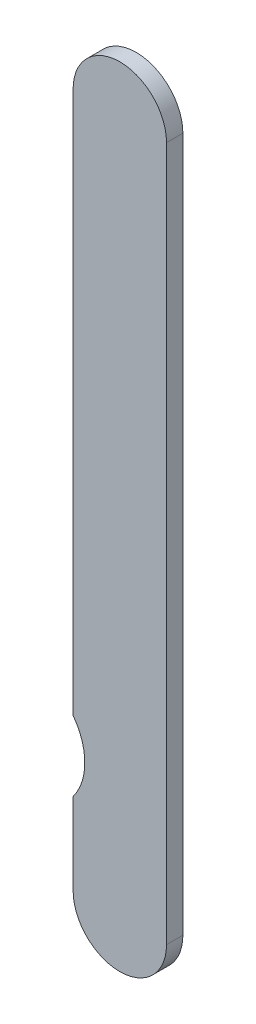
ISO-10303-21;
HEADER;
FILE_DESCRIPTION(('STEP AP214'),'2;1');
FILE_NAME('part.step','',(''),(''),'','','');
FILE_SCHEMA(('AUTOMOTIVE_DESIGN { 1 0 10303 214 1 1 1 1 }'));
ENDSEC;
DATA;
#1=APPLICATION_CONTEXT('core data for automotive mechanical design processes');
#2=APPLICATION_PROTOCOL_DEFINITION('international standard','automotive_design',2000,#1);
#3=PRODUCT_CONTEXT('',#1,'mechanical');
#4=PRODUCT('Part','Part','',(#3));
#5=PRODUCT_RELATED_PRODUCT_CATEGORY('part','',(#4));
#6=PRODUCT_DEFINITION_FORMATION('','',#4);
#7=PRODUCT_DEFINITION_CONTEXT('part definition',#1,'design');
#8=PRODUCT_DEFINITION('design','',#6,#7);
#9=PRODUCT_DEFINITION_SHAPE('','',#8);
#10=(LENGTH_UNIT() NAMED_UNIT(*) SI_UNIT(.MILLI.,.METRE.));
#11=(NAMED_UNIT(*) PLANE_ANGLE_UNIT() SI_UNIT($,.RADIAN.));
#12=(NAMED_UNIT(*) SI_UNIT($,.STERADIAN.) SOLID_ANGLE_UNIT());
#13=UNCERTAINTY_MEASURE_WITH_UNIT(LENGTH_MEASURE(1.E-05),#10,'distance_accuracy_value','');
#14=(GEOMETRIC_REPRESENTATION_CONTEXT(3) GLOBAL_UNCERTAINTY_ASSIGNED_CONTEXT((#13)) GLOBAL_UNIT_ASSIGNED_CONTEXT((#10,
#11,#12)) REPRESENTATION_CONTEXT('',''));
#15=CARTESIAN_POINT('',(0.,0.,0.));
#16=DIRECTION('',(0.,0.,1.));
#17=DIRECTION('',(1.,0.,0.));
#18=AXIS2_PLACEMENT_3D('',#15,#16,#17);
#19=CARTESIAN_POINT('',(82.85,-109.4625,1.6));
#20=DIRECTION('',(1.,0.,0.));
#21=DIRECTION('',(0.,1.,0.));
#22=AXIS2_PLACEMENT_3D('',#19,#20,#21);
#23=PLANE('',#22);
#24=DIRECTION('',(0.,0.,1.));
#25=VECTOR('',#24,1.);
#26=CARTESIAN_POINT('',(82.85,-110.95,1.6));
#27=LINE('',#26,#25);
#28=CARTESIAN_POINT('',(82.85,-110.95,1.6));
#29=VERTEX_POINT('',#28);
#30=CARTESIAN_POINT('',(82.85,-110.95,1.635));
#31=VERTEX_POINT('',#30);
#32=EDGE_CURVE('E11',#29,#31,#27,.T.);
#33=ORIENTED_EDGE('',*,*,#32,.T.);
#34=DIRECTION('',(0.,-1.,0.));
#35=VECTOR('',#34,1.);
#36=CARTESIAN_POINT('',(82.85,-109.4625,1.635));
#37=LINE('',#36,#35);
#38=CARTESIAN_POINT('',(82.85,-110.775,1.635));
#39=VERTEX_POINT('',#38);
#40=EDGE_CURVE('E86',#39,#31,#37,.T.);
#41=ORIENTED_EDGE('',*,*,#40,.F.);
#42=DIRECTION('',(0.,0.,-1.));
#43=VECTOR('',#42,1.);
#44=CARTESIAN_POINT('',(82.85,-110.775,-0.045));
#45=LINE('',#44,#43);
#46=CARTESIAN_POINT('',(82.85,-110.775,1.6));
#47=VERTEX_POINT('',#46);
#48=EDGE_CURVE('E81',#39,#47,#45,.T.);
#49=ORIENTED_EDGE('',*,*,#48,.T.);
#50=DIRECTION('',(0.,-1.,0.));
#51=VECTOR('',#50,1.);
#52=CARTESIAN_POINT('',(82.85,-109.4625,1.6));
#53=LINE('',#52,#51);
#54=EDGE_CURVE('E132',#47,#29,#53,.T.);
#55=ORIENTED_EDGE('',*,*,#54,.T.);
#56=EDGE_LOOP('',(#33,#41,#49,#55));
#57=FACE_BOUND('',#56,.T.);
#58=ADVANCED_FACE('F17',(#57),#23,.F.);
#59=CARTESIAN_POINT('',(82.95,-110.95,1.6));
#60=DIRECTION('',(0.,0.,-1.));
#61=DIRECTION('',(-1.,0.,0.));
#62=AXIS2_PLACEMENT_3D('',#59,#60,#61);
#63=CYLINDRICAL_SURFACE('',#62,0.1);
#64=CARTESIAN_POINT('',(82.95,-110.95,1.6));
#65=DIRECTION('',(0.,0.,1.));
#66=DIRECTION('',(-1.,0.,0.));
#67=AXIS2_PLACEMENT_3D('',#64,#65,#66);
#68=CIRCLE('',#67,0.1);
#69=CARTESIAN_POINT('',(83.05,-110.95,1.6));
#70=VERTEX_POINT('',#69);
#71=EDGE_CURVE('E131',#29,#70,#68,.T.);
#72=ORIENTED_EDGE('',*,*,#71,.T.);
#73=DIRECTION('',(0.,0.,1.));
#74=VECTOR('',#73,1.);
#75=CARTESIAN_POINT('',(83.05,-110.95,1.6));
#76=LINE('',#75,#74);
#77=CARTESIAN_POINT('',(83.05,-110.95,1.635));
#78=VERTEX_POINT('',#77);
#79=EDGE_CURVE('E26',#70,#78,#76,.T.);
#80=ORIENTED_EDGE('',*,*,#79,.T.);
#81=CARTESIAN_POINT('',(82.95,-110.95,1.635));
#82=DIRECTION('',(0.,0.,1.));
#83=DIRECTION('',(-1.,0.,0.));
#84=AXIS2_PLACEMENT_3D('',#81,#82,#83);
#85=CIRCLE('',#84,0.1);
#86=EDGE_CURVE('E91',#31,#78,#85,.T.);
#87=ORIENTED_EDGE('',*,*,#86,.F.);
#88=ORIENTED_EDGE('',*,*,#32,.F.);
#89=EDGE_LOOP('',(#72,#80,#87,#88));
#90=FACE_BOUND('',#89,.T.);
#91=ADVANCED_FACE('F215',(#90),#63,.T.);
#92=CARTESIAN_POINT('',(83.05,-110.95,1.6));
#93=DIRECTION('',(-1.,0.,0.));
#94=DIRECTION('',(0.,0.,1.));
#95=AXIS2_PLACEMENT_3D('',#92,#93,#94);
#96=PLANE('',#95);
#97=DIRECTION('',(0.,1.,0.));
#98=VECTOR('',#97,1.);
#99=CARTESIAN_POINT('',(83.05,-110.95,1.6));
#100=LINE('',#99,#98);
#101=CARTESIAN_POINT('',(83.05,-109.4625,1.6));
#102=VERTEX_POINT('',#101);
#103=EDGE_CURVE('E123',#70,#102,#100,.T.);
#104=ORIENTED_EDGE('',*,*,#103,.T.);
#105=DIRECTION('',(0.,0.,1.));
#106=VECTOR('',#105,1.);
#107=CARTESIAN_POINT('',(83.05,-109.4625,1.6));
#108=LINE('',#107,#106);
#109=CARTESIAN_POINT('',(83.05,-109.4625,1.635));
#110=VERTEX_POINT('',#109);
#111=EDGE_CURVE('E124',#102,#110,#108,.T.);
#112=ORIENTED_EDGE('',*,*,#111,.T.);
#113=DIRECTION('',(0.,1.,0.));
#114=VECTOR('',#113,1.);
#115=CARTESIAN_POINT('',(83.05,-110.95,1.635));
#116=LINE('',#115,#114);
#117=EDGE_CURVE('E127',#78,#110,#116,.T.);
#118=ORIENTED_EDGE('',*,*,#117,.F.);
#119=ORIENTED_EDGE('',*,*,#79,.F.);
#120=EDGE_LOOP('',(#104,#112,#118,#119));
#121=FACE_BOUND('',#120,.T.);
#122=ADVANCED_FACE('F220',(#121),#96,.F.);
#123=CARTESIAN_POINT('',(82.95,-109.4625,1.6));
#124=DIRECTION('',(0.,0.,-1.));
#125=DIRECTION('',(1.,-1.42108547152E-13,0.));
#126=AXIS2_PLACEMENT_3D('',#123,#124,#125);
#127=CYLINDRICAL_SURFACE('',#126,0.1);
#128=CARTESIAN_POINT('',(82.95,-109.4625,1.6));
#129=DIRECTION('',(0.,0.,1.));
#130=DIRECTION('',(1.,-1.42108547152E-13,0.));
#131=AXIS2_PLACEMENT_3D('',#128,#129,#130);
#132=CIRCLE('',#131,0.1);
#133=CARTESIAN_POINT('',(82.85,-109.4625,1.6));
#134=VERTEX_POINT('',#133);
#135=EDGE_CURVE('E108',#102,#134,#132,.T.);
#136=ORIENTED_EDGE('',*,*,#135,.T.);
#137=DIRECTION('',(0.,0.,1.));
#138=VECTOR('',#137,1.);
#139=CARTESIAN_POINT('',(82.85,-109.4625,1.6));
#140=LINE('',#139,#138);
#141=CARTESIAN_POINT('',(82.85,-109.4625,1.635));
#142=VERTEX_POINT('',#141);
#143=EDGE_CURVE('E117',#134,#142,#140,.T.);
#144=ORIENTED_EDGE('',*,*,#143,.T.);
#145=CARTESIAN_POINT('',(82.95,-109.4625,1.635));
#146=DIRECTION('',(0.,0.,1.));
#147=DIRECTION('',(1.,-1.42108547152E-13,0.));
#148=AXIS2_PLACEMENT_3D('',#145,#146,#147);
#149=CIRCLE('',#148,0.1);
#150=EDGE_CURVE('E92',#110,#142,#149,.T.);
#151=ORIENTED_EDGE('',*,*,#150,.F.);
#152=ORIENTED_EDGE('',*,*,#111,.F.);
#153=EDGE_LOOP('',(#136,#144,#151,#152));
#154=FACE_BOUND('',#153,.T.);
#155=ADVANCED_FACE('F219',(#154),#127,.T.);
#156=CARTESIAN_POINT('',(82.85,-109.4625,1.635));
#157=DIRECTION('',(0.,0.,1.));
#158=DIRECTION('',(1.,0.,0.));
#159=AXIS2_PLACEMENT_3D('',#156,#157,#158);
#160=PLANE('',#159);
#161=ORIENTED_EDGE('',*,*,#150,.T.);
#162=DIRECTION('',(0.,-1.,0.));
#163=VECTOR('',#162,1.);
#164=CARTESIAN_POINT('',(82.85,-109.4625,1.635));
#165=LINE('',#164,#163);
#166=CARTESIAN_POINT('',(82.85,-110.6249999999,1.635));
#167=VERTEX_POINT('',#166);
#168=EDGE_CURVE('E105',#142,#167,#165,.T.);
#169=ORIENTED_EDGE('',*,*,#168,.T.);
#170=CARTESIAN_POINT('',(82.75,-110.7,1.635));
#171=DIRECTION('',(0.,0.,-1.));
#172=DIRECTION('',(0.,-1.,0.));
#173=AXIS2_PLACEMENT_3D('',#170,#171,#172);
#174=CIRCLE('',#173,0.125);
#175=EDGE_CURVE('E97',#167,#39,#174,.T.);
#176=ORIENTED_EDGE('',*,*,#175,.T.);
#177=ORIENTED_EDGE('',*,*,#40,.T.);
#178=ORIENTED_EDGE('',*,*,#86,.T.);
#179=ORIENTED_EDGE('',*,*,#117,.T.);
#180=EDGE_LOOP('',(#161,#169,#176,#177,#178,#179));
#181=FACE_BOUND('',#180,.T.);
#182=ADVANCED_FACE('F103',(#181),#160,.T.);
#183=CARTESIAN_POINT('',(82.75,-110.7,-0.045));
#184=DIRECTION('',(0.,0.,-1.));
#185=DIRECTION('',(0.,-1.,0.));
#186=AXIS2_PLACEMENT_3D('',#183,#184,#185);
#187=CYLINDRICAL_SURFACE('',#186,0.125);
#188=ORIENTED_EDGE('',*,*,#175,.F.);
#189=DIRECTION('',(0.,0.,-1.));
#190=VECTOR('',#189,1.);
#191=CARTESIAN_POINT('',(82.85,-110.625,-0.045));
#192=LINE('',#191,#190);
#193=CARTESIAN_POINT('',(82.85,-110.6249999999,1.6));
#194=VERTEX_POINT('',#193);
#195=EDGE_CURVE('E201',#167,#194,#192,.T.);
#196=ORIENTED_EDGE('',*,*,#195,.T.);
#197=CARTESIAN_POINT('',(82.75,-110.7,1.6));
#198=DIRECTION('',(0.,0.,-1.));
#199=DIRECTION('',(0.,-1.,0.));
#200=AXIS2_PLACEMENT_3D('',#197,#198,#199);
#201=CIRCLE('',#200,0.125);
#202=EDGE_CURVE('E99',#194,#47,#201,.T.);
#203=ORIENTED_EDGE('',*,*,#202,.T.);
#204=ORIENTED_EDGE('',*,*,#48,.F.);
#205=EDGE_LOOP('',(#188,#196,#203,#204));
#206=FACE_BOUND('',#205,.T.);
#207=ADVANCED_FACE('F95',(#206),#187,.F.);
#208=CARTESIAN_POINT('',(82.85,-109.4625,1.6));
#209=DIRECTION('',(0.,0.,1.));
#210=DIRECTION('',(1.,0.,0.));
#211=AXIS2_PLACEMENT_3D('',#208,#209,#210);
#212=PLANE('',#211);
#213=ORIENTED_EDGE('',*,*,#103,.F.);
#214=ORIENTED_EDGE('',*,*,#71,.F.);
#215=ORIENTED_EDGE('',*,*,#54,.F.);
#216=ORIENTED_EDGE('',*,*,#202,.F.);
#217=DIRECTION('',(0.,-1.,0.));
#218=VECTOR('',#217,1.);
#219=CARTESIAN_POINT('',(82.85,-109.4625,1.6));
#220=LINE('',#219,#218);
#221=EDGE_CURVE('E119',#134,#194,#220,.T.);
#222=ORIENTED_EDGE('',*,*,#221,.F.);
#223=ORIENTED_EDGE('',*,*,#135,.F.);
#224=EDGE_LOOP('',(#213,#214,#215,#216,#222,#223));
#225=FACE_BOUND('',#224,.T.);
#226=ADVANCED_FACE('F213',(#225),#212,.F.);
#227=CARTESIAN_POINT('',(82.85,-109.4625,1.6));
#228=DIRECTION('',(1.,0.,0.));
#229=DIRECTION('',(0.,1.,0.));
#230=AXIS2_PLACEMENT_3D('',#227,#228,#229);
#231=PLANE('',#230);
#232=ORIENTED_EDGE('',*,*,#195,.F.);
#233=ORIENTED_EDGE('',*,*,#168,.F.);
#234=ORIENTED_EDGE('',*,*,#143,.F.);
#235=ORIENTED_EDGE('',*,*,#221,.T.);
#236=EDGE_LOOP('',(#232,#233,#234,#235));
#237=FACE_BOUND('',#236,.T.);
#238=ADVANCED_FACE('F207',(#237),#231,.F.);
#239=CLOSED_SHELL('',(#58,#91,#122,#155,#182,#207,#226,#238));
#240=MANIFOLD_SOLID_BREP('B1',#239);
#241=ADVANCED_BREP_SHAPE_REPRESENTATION('',(#18,#240),#14);
#242=SHAPE_DEFINITION_REPRESENTATION(#9,#241);
ENDSEC;
END-ISO-10303-21;
